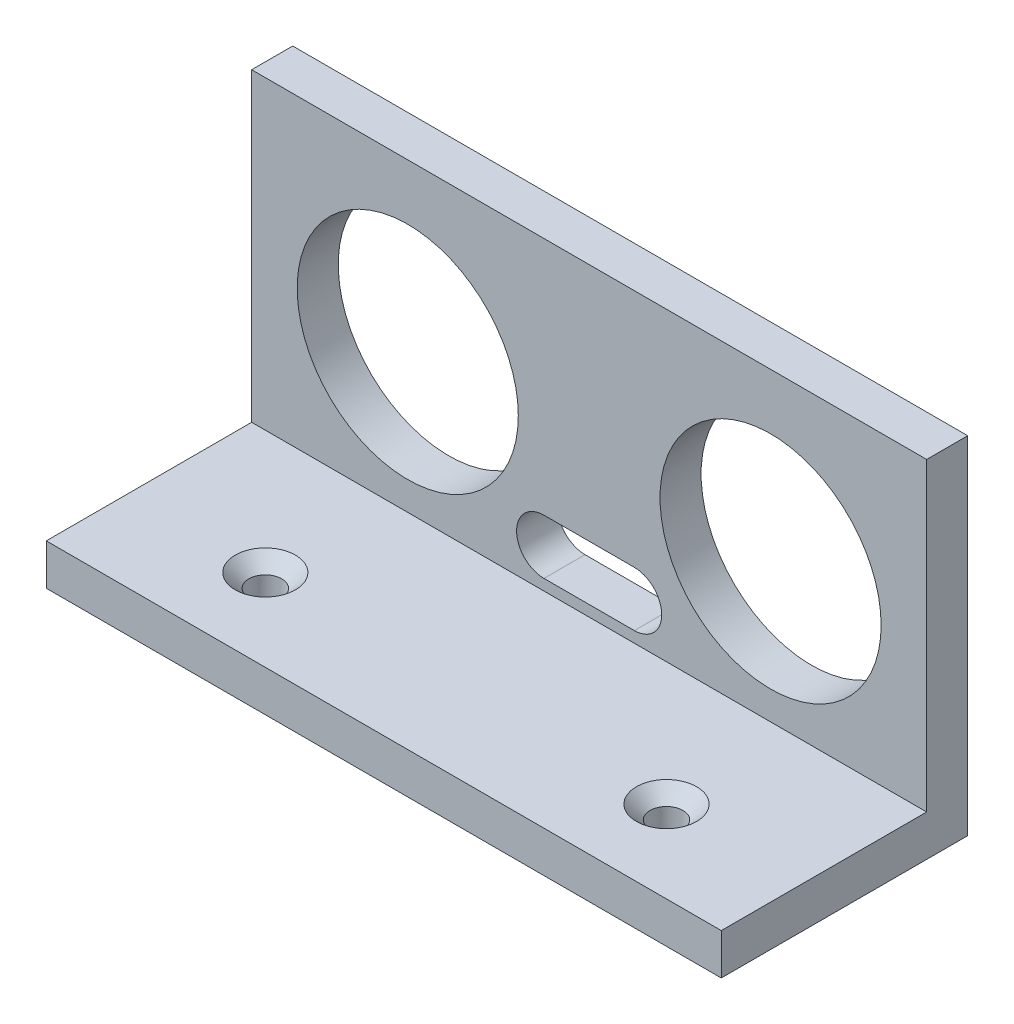
ISO-10303-21;
HEADER;
FILE_DESCRIPTION(('STEP AP214'),'2;1');
FILE_NAME('part.step','',(''),(''),'','','');
FILE_SCHEMA(('AUTOMOTIVE_DESIGN { 1 0 10303 214 1 1 1 1 }'));
ENDSEC;
DATA;
#1=APPLICATION_CONTEXT('core data for automotive mechanical design processes');
#2=APPLICATION_PROTOCOL_DEFINITION('international standard','automotive_design',2000,#1);
#3=PRODUCT_CONTEXT('',#1,'mechanical');
#4=PRODUCT('Part','Part','',(#3));
#5=PRODUCT_RELATED_PRODUCT_CATEGORY('part','',(#4));
#6=PRODUCT_DEFINITION_FORMATION('','',#4);
#7=PRODUCT_DEFINITION_CONTEXT('part definition',#1,'design');
#8=PRODUCT_DEFINITION('design','',#6,#7);
#9=PRODUCT_DEFINITION_SHAPE('','',#8);
#10=(LENGTH_UNIT() NAMED_UNIT(*) SI_UNIT(.MILLI.,.METRE.));
#11=(NAMED_UNIT(*) PLANE_ANGLE_UNIT() SI_UNIT($,.RADIAN.));
#12=(NAMED_UNIT(*) SI_UNIT($,.STERADIAN.) SOLID_ANGLE_UNIT());
#13=UNCERTAINTY_MEASURE_WITH_UNIT(LENGTH_MEASURE(1.E-05),#10,'distance_accuracy_value','');
#14=(GEOMETRIC_REPRESENTATION_CONTEXT(3) GLOBAL_UNCERTAINTY_ASSIGNED_CONTEXT((#13)) GLOBAL_UNIT_ASSIGNED_CONTEXT((#10,
#11,#12)) REPRESENTATION_CONTEXT('',''));
#15=CARTESIAN_POINT('',(0.,0.,0.));
#16=DIRECTION('',(0.,0.,1.));
#17=DIRECTION('',(1.,0.,0.));
#18=AXIS2_PLACEMENT_3D('',#15,#16,#17);
#19=CARTESIAN_POINT('',(0.,0.,1.5));
#20=DIRECTION('',(0.,0.,-1.));
#21=DIRECTION('',(-1.,0.,0.));
#22=AXIS2_PLACEMENT_3D('',#19,#20,#21);
#23=PLANE('',#22);
#24=CARTESIAN_POINT('',(13.25,0.500000000000002,1.5));
#25=DIRECTION('',(0.,0.,1.));
#26=DIRECTION('',(-1.,0.,0.));
#27=AXIS2_PLACEMENT_3D('',#24,#25,#26);
#28=CIRCLE('',#27,8.075);
#29=CARTESIAN_POINT('',(21.325,0.500000000000002,1.5));
#30=VERTEX_POINT('',#29);
#31=EDGE_CURVE('E169',#30,#30,#28,.T.);
#32=ORIENTED_EDGE('',*,*,#31,.F.);
#33=EDGE_LOOP('',(#32));
#34=FACE_BOUND('',#33,.T.);
#35=DIRECTION('',(-1.,0.,0.));
#36=VECTOR('',#35,1.);
#37=CARTESIAN_POINT('',(-3.3,-4.85,1.5));
#38=LINE('',#37,#36);
#39=CARTESIAN_POINT('',(3.3,-4.85,1.5));
#40=VERTEX_POINT('',#39);
#41=CARTESIAN_POINT('',(-3.3,-4.85,1.5));
#42=VERTEX_POINT('',#41);
#43=EDGE_CURVE('E150',#40,#42,#38,.T.);
#44=ORIENTED_EDGE('',*,*,#43,.F.);
#45=CARTESIAN_POINT('',(3.3,-6.85,1.5));
#46=DIRECTION('',(0.,0.,1.));
#47=DIRECTION('',(-1.,0.,0.));
#48=AXIS2_PLACEMENT_3D('',#45,#46,#47);
#49=CIRCLE('',#48,2.);
#50=CARTESIAN_POINT('',(3.3,-8.85,1.5));
#51=VERTEX_POINT('',#50);
#52=EDGE_CURVE('E65',#51,#40,#49,.T.);
#53=ORIENTED_EDGE('',*,*,#52,.F.);
#54=DIRECTION('',(1.,0.,0.));
#55=VECTOR('',#54,1.);
#56=CARTESIAN_POINT('',(3.3,-8.85,1.5));
#57=LINE('',#56,#55);
#58=CARTESIAN_POINT('',(-3.3,-8.85,1.5));
#59=VERTEX_POINT('',#58);
#60=EDGE_CURVE('E138',#59,#51,#57,.T.);
#61=ORIENTED_EDGE('',*,*,#60,.F.);
#62=CARTESIAN_POINT('',(-3.3,-6.85,1.5));
#63=DIRECTION('',(0.,0.,1.));
#64=DIRECTION('',(1.,0.,0.));
#65=AXIS2_PLACEMENT_3D('',#62,#63,#64);
#66=CIRCLE('',#65,2.);
#67=EDGE_CURVE('E145',#42,#59,#66,.T.);
#68=ORIENTED_EDGE('',*,*,#67,.F.);
#69=EDGE_LOOP('',(#44,#53,#61,#68));
#70=FACE_BOUND('',#69,.T.);
#71=CARTESIAN_POINT('',(-13.25,0.500000000000002,1.5));
#72=DIRECTION('',(0.,0.,1.));
#73=DIRECTION('',(1.,0.,0.));
#74=AXIS2_PLACEMENT_3D('',#71,#72,#73);
#75=CIRCLE('',#74,8.075);
#76=CARTESIAN_POINT('',(-5.175,0.500000000000002,1.5));
#77=VERTEX_POINT('',#76);
#78=EDGE_CURVE('E178',#77,#77,#75,.T.);
#79=ORIENTED_EDGE('',*,*,#78,.F.);
#80=EDGE_LOOP('',(#79));
#81=FACE_BOUND('',#80,.T.);
#82=DIRECTION('',(-1.,0.,0.));
#83=VECTOR('',#82,1.);
#84=CARTESIAN_POINT('',(-24.65,-9.65,1.5));
#85=LINE('',#84,#83);
#86=CARTESIAN_POINT('',(24.65,-9.65,1.5));
#87=VERTEX_POINT('',#86);
#88=CARTESIAN_POINT('',(-24.65,-9.65,1.5));
#89=VERTEX_POINT('',#88);
#90=EDGE_CURVE('E208',#87,#89,#85,.T.);
#91=ORIENTED_EDGE('',*,*,#90,.F.);
#92=DIRECTION('',(0.,1.,0.));
#93=VECTOR('',#92,1.);
#94=CARTESIAN_POINT('',(24.65,-12.65,1.5));
#95=LINE('',#94,#93);
#96=CARTESIAN_POINT('',(24.65,12.65,1.5));
#97=VERTEX_POINT('',#96);
#98=EDGE_CURVE('E236',#87,#97,#95,.T.);
#99=ORIENTED_EDGE('',*,*,#98,.T.);
#100=DIRECTION('',(-1.,0.,0.));
#101=VECTOR('',#100,1.);
#102=CARTESIAN_POINT('',(-24.65,12.65,1.5));
#103=LINE('',#102,#101);
#104=CARTESIAN_POINT('',(-24.65,12.65,1.5));
#105=VERTEX_POINT('',#104);
#106=EDGE_CURVE('E239',#97,#105,#103,.T.);
#107=ORIENTED_EDGE('',*,*,#106,.T.);
#108=DIRECTION('',(0.,-1.,0.));
#109=VECTOR('',#108,1.);
#110=CARTESIAN_POINT('',(-24.65,-12.65,1.5));
#111=LINE('',#110,#109);
#112=EDGE_CURVE('E242',#105,#89,#111,.T.);
#113=ORIENTED_EDGE('',*,*,#112,.T.);
#114=EDGE_LOOP('',(#91,#99,#107,#113));
#115=FACE_BOUND('',#114,.T.);
#116=ADVANCED_FACE('F49',(#34,#70,#81,#115),#23,.F.);
#117=CARTESIAN_POINT('',(24.65,-12.65,1.5));
#118=DIRECTION('',(-1.,0.,0.));
#119=DIRECTION('',(0.,0.,1.));
#120=AXIS2_PLACEMENT_3D('',#117,#118,#119);
#121=PLANE('',#120);
#122=DIRECTION('',(0.,1.,0.));
#123=VECTOR('',#122,1.);
#124=CARTESIAN_POINT('',(24.65,-12.65,-1.5));
#125=LINE('',#124,#123);
#126=CARTESIAN_POINT('',(24.65,-12.65,-1.5));
#127=VERTEX_POINT('',#126);
#128=CARTESIAN_POINT('',(24.65,12.65,-1.5));
#129=VERTEX_POINT('',#128);
#130=EDGE_CURVE('E235',#127,#129,#125,.T.);
#131=ORIENTED_EDGE('',*,*,#130,.T.);
#132=DIRECTION('',(0.,0.,-1.));
#133=VECTOR('',#132,1.);
#134=CARTESIAN_POINT('',(24.65,12.65,1.5));
#135=LINE('',#134,#133);
#136=EDGE_CURVE('E11',#97,#129,#135,.T.);
#137=ORIENTED_EDGE('',*,*,#136,.F.);
#138=ORIENTED_EDGE('',*,*,#98,.F.);
#139=DIRECTION('',(0.,0.,-1.));
#140=VECTOR('',#139,1.);
#141=CARTESIAN_POINT('',(24.65,-9.65,16.5));
#142=LINE('',#141,#140);
#143=CARTESIAN_POINT('',(24.65,-9.65,16.5));
#144=VERTEX_POINT('',#143);
#145=EDGE_CURVE('E231',#144,#87,#142,.T.);
#146=ORIENTED_EDGE('',*,*,#145,.F.);
#147=DIRECTION('',(0.,1.,0.));
#148=VECTOR('',#147,1.);
#149=CARTESIAN_POINT('',(24.65,-12.65,16.5));
#150=LINE('',#149,#148);
#151=CARTESIAN_POINT('',(24.65,-12.65,16.5));
#152=VERTEX_POINT('',#151);
#153=EDGE_CURVE('E209',#152,#144,#150,.T.);
#154=ORIENTED_EDGE('',*,*,#153,.F.);
#155=DIRECTION('',(0.,0.,-1.));
#156=VECTOR('',#155,1.);
#157=CARTESIAN_POINT('',(24.65,-12.65,1.5));
#158=LINE('',#157,#156);
#159=EDGE_CURVE('E245',#152,#127,#158,.T.);
#160=ORIENTED_EDGE('',*,*,#159,.T.);
#161=EDGE_LOOP('',(#131,#137,#138,#146,#154,#160));
#162=FACE_BOUND('',#161,.T.);
#163=ADVANCED_FACE('F51',(#162),#121,.F.);
#164=CARTESIAN_POINT('',(-24.65,12.65,1.5));
#165=DIRECTION('',(0.,-1.,0.));
#166=DIRECTION('',(0.,0.,-1.));
#167=AXIS2_PLACEMENT_3D('',#164,#165,#166);
#168=PLANE('',#167);
#169=DIRECTION('',(-1.,0.,0.));
#170=VECTOR('',#169,1.);
#171=CARTESIAN_POINT('',(-24.65,12.65,-1.5));
#172=LINE('',#171,#170);
#173=CARTESIAN_POINT('',(-24.65,12.65,-1.5));
#174=VERTEX_POINT('',#173);
#175=EDGE_CURVE('E249',#129,#174,#172,.T.);
#176=ORIENTED_EDGE('',*,*,#175,.T.);
#177=DIRECTION('',(0.,0.,-1.));
#178=VECTOR('',#177,1.);
#179=CARTESIAN_POINT('',(-24.65,12.65,1.5));
#180=LINE('',#179,#178);
#181=EDGE_CURVE('E58',#105,#174,#180,.T.);
#182=ORIENTED_EDGE('',*,*,#181,.F.);
#183=ORIENTED_EDGE('',*,*,#106,.F.);
#184=ORIENTED_EDGE('',*,*,#136,.T.);
#185=EDGE_LOOP('',(#176,#182,#183,#184));
#186=FACE_BOUND('',#185,.T.);
#187=ADVANCED_FACE('F292',(#186),#168,.F.);
#188=CARTESIAN_POINT('',(-24.65,-12.65,1.5));
#189=DIRECTION('',(1.,0.,0.));
#190=DIRECTION('',(0.,0.,-1.));
#191=AXIS2_PLACEMENT_3D('',#188,#189,#190);
#192=PLANE('',#191);
#193=DIRECTION('',(0.,-1.,0.));
#194=VECTOR('',#193,1.);
#195=CARTESIAN_POINT('',(-24.65,-12.65,-1.5));
#196=LINE('',#195,#194);
#197=CARTESIAN_POINT('',(-24.65,-12.65,-1.5));
#198=VERTEX_POINT('',#197);
#199=EDGE_CURVE('E252',#174,#198,#196,.T.);
#200=ORIENTED_EDGE('',*,*,#199,.T.);
#201=DIRECTION('',(0.,0.,-1.));
#202=VECTOR('',#201,1.);
#203=CARTESIAN_POINT('',(-24.65,-12.65,1.5));
#204=LINE('',#203,#202);
#205=CARTESIAN_POINT('',(-24.65,-12.65,16.5));
#206=VERTEX_POINT('',#205);
#207=EDGE_CURVE('E260',#206,#198,#204,.T.);
#208=ORIENTED_EDGE('',*,*,#207,.F.);
#209=DIRECTION('',(0.,-1.,0.));
#210=VECTOR('',#209,1.);
#211=CARTESIAN_POINT('',(-24.65,-12.65,16.5));
#212=LINE('',#211,#210);
#213=CARTESIAN_POINT('',(-24.65,-9.65,16.5));
#214=VERTEX_POINT('',#213);
#215=EDGE_CURVE('E216',#214,#206,#212,.T.);
#216=ORIENTED_EDGE('',*,*,#215,.F.);
#217=DIRECTION('',(0.,0.,-1.));
#218=VECTOR('',#217,1.);
#219=CARTESIAN_POINT('',(-24.65,-9.65,16.5));
#220=LINE('',#219,#218);
#221=EDGE_CURVE('E224',#214,#89,#220,.T.);
#222=ORIENTED_EDGE('',*,*,#221,.T.);
#223=ORIENTED_EDGE('',*,*,#112,.F.);
#224=ORIENTED_EDGE('',*,*,#181,.T.);
#225=EDGE_LOOP('',(#200,#208,#216,#222,#223,#224));
#226=FACE_BOUND('',#225,.T.);
#227=ADVANCED_FACE('F270',(#226),#192,.F.);
#228=CARTESIAN_POINT('',(-24.65,-12.65,1.5));
#229=DIRECTION('',(0.,1.,0.));
#230=DIRECTION('',(0.,0.,1.));
#231=AXIS2_PLACEMENT_3D('',#228,#229,#230);
#232=PLANE('',#231);
#233=CARTESIAN_POINT('',(-14.65,-12.65,10.5));
#234=DIRECTION('',(0.,1.,0.));
#235=DIRECTION('',(0.,0.,1.));
#236=AXIS2_PLACEMENT_3D('',#233,#234,#235);
#237=CIRCLE('',#236,1.2);
#238=CARTESIAN_POINT('',(-14.65,-12.65,11.7));
#239=VERTEX_POINT('',#238);
#240=EDGE_CURVE('E193',#239,#239,#237,.T.);
#241=ORIENTED_EDGE('',*,*,#240,.T.);
#242=EDGE_LOOP('',(#241));
#243=FACE_BOUND('',#242,.T.);
#244=CARTESIAN_POINT('',(14.65,-12.65,10.5));
#245=DIRECTION('',(0.,1.,0.));
#246=DIRECTION('',(0.,0.,1.));
#247=AXIS2_PLACEMENT_3D('',#244,#245,#246);
#248=CIRCLE('',#247,1.2);
#249=CARTESIAN_POINT('',(14.65,-12.65,11.7));
#250=VERTEX_POINT('',#249);
#251=EDGE_CURVE('E204',#250,#250,#248,.T.);
#252=ORIENTED_EDGE('',*,*,#251,.T.);
#253=EDGE_LOOP('',(#252));
#254=FACE_BOUND('',#253,.T.);
#255=DIRECTION('',(1.,0.,0.));
#256=VECTOR('',#255,1.);
#257=CARTESIAN_POINT('',(-24.65,-12.65,-1.5));
#258=LINE('',#257,#256);
#259=EDGE_CURVE('E240',#198,#127,#258,.T.);
#260=ORIENTED_EDGE('',*,*,#259,.T.);
#261=ORIENTED_EDGE('',*,*,#159,.F.);
#262=DIRECTION('',(1.,0.,0.));
#263=VECTOR('',#262,1.);
#264=CARTESIAN_POINT('',(-24.65,-12.65,16.5));
#265=LINE('',#264,#263);
#266=EDGE_CURVE('E220',#206,#152,#265,.T.);
#267=ORIENTED_EDGE('',*,*,#266,.F.);
#268=ORIENTED_EDGE('',*,*,#207,.T.);
#269=EDGE_LOOP('',(#260,#261,#267,#268));
#270=FACE_BOUND('',#269,.T.);
#271=ADVANCED_FACE('F278',(#243,#254,#270),#232,.F.);
#272=CARTESIAN_POINT('',(0.,0.,-1.5));
#273=DIRECTION('',(0.,0.,-1.));
#274=DIRECTION('',(-1.,0.,0.));
#275=AXIS2_PLACEMENT_3D('',#272,#273,#274);
#276=PLANE('',#275);
#277=CARTESIAN_POINT('',(13.25,0.500000000000002,-1.5));
#278=DIRECTION('',(0.,0.,-1.));
#279=DIRECTION('',(-1.,0.,0.));
#280=AXIS2_PLACEMENT_3D('',#277,#278,#279);
#281=CIRCLE('',#280,8.075);
#282=CARTESIAN_POINT('',(21.325,0.500000000000002,-1.5));
#283=VERTEX_POINT('',#282);
#284=EDGE_CURVE('E170',#283,#283,#281,.F.);
#285=ORIENTED_EDGE('',*,*,#284,.T.);
#286=EDGE_LOOP('',(#285));
#287=FACE_BOUND('',#286,.T.);
#288=CARTESIAN_POINT('',(3.3,-6.85,-1.5));
#289=DIRECTION('',(0.,0.,-1.));
#290=DIRECTION('',(-1.,0.,0.));
#291=AXIS2_PLACEMENT_3D('',#288,#289,#290);
#292=CIRCLE('',#291,2.);
#293=CARTESIAN_POINT('',(3.3,-8.85,-1.5));
#294=VERTEX_POINT('',#293);
#295=CARTESIAN_POINT('',(3.3,-4.85,-1.5));
#296=VERTEX_POINT('',#295);
#297=EDGE_CURVE('E130',#294,#296,#292,.F.);
#298=ORIENTED_EDGE('',*,*,#297,.T.);
#299=DIRECTION('',(-1.,0.,0.));
#300=VECTOR('',#299,1.);
#301=CARTESIAN_POINT('',(-3.3,-4.85,-1.5));
#302=LINE('',#301,#300);
#303=CARTESIAN_POINT('',(-3.3,-4.85,-1.5));
#304=VERTEX_POINT('',#303);
#305=EDGE_CURVE('E135',#296,#304,#302,.T.);
#306=ORIENTED_EDGE('',*,*,#305,.T.);
#307=CARTESIAN_POINT('',(-3.3,-6.85,-1.5));
#308=DIRECTION('',(0.,0.,-1.));
#309=DIRECTION('',(-1.,0.,0.));
#310=AXIS2_PLACEMENT_3D('',#307,#308,#309);
#311=CIRCLE('',#310,2.);
#312=CARTESIAN_POINT('',(-3.3,-8.85,-1.5));
#313=VERTEX_POINT('',#312);
#314=EDGE_CURVE('E165',#304,#313,#311,.F.);
#315=ORIENTED_EDGE('',*,*,#314,.T.);
#316=DIRECTION('',(1.,0.,0.));
#317=VECTOR('',#316,1.);
#318=CARTESIAN_POINT('',(3.3,-8.85,-1.5));
#319=LINE('',#318,#317);
#320=EDGE_CURVE('E157',#313,#294,#319,.T.);
#321=ORIENTED_EDGE('',*,*,#320,.T.);
#322=EDGE_LOOP('',(#298,#306,#315,#321));
#323=FACE_BOUND('',#322,.T.);
#324=CARTESIAN_POINT('',(-13.25,0.500000000000002,-1.5));
#325=DIRECTION('',(0.,0.,-1.));
#326=DIRECTION('',(-1.,0.,0.));
#327=AXIS2_PLACEMENT_3D('',#324,#325,#326);
#328=CIRCLE('',#327,8.075);
#329=CARTESIAN_POINT('',(-5.175,0.500000000000002,-1.5));
#330=VERTEX_POINT('',#329);
#331=EDGE_CURVE('E174',#330,#330,#328,.F.);
#332=ORIENTED_EDGE('',*,*,#331,.T.);
#333=EDGE_LOOP('',(#332));
#334=FACE_BOUND('',#333,.T.);
#335=ORIENTED_EDGE('',*,*,#130,.F.);
#336=ORIENTED_EDGE('',*,*,#259,.F.);
#337=ORIENTED_EDGE('',*,*,#199,.F.);
#338=ORIENTED_EDGE('',*,*,#175,.F.);
#339=EDGE_LOOP('',(#335,#336,#337,#338));
#340=FACE_BOUND('',#339,.T.);
#341=ADVANCED_FACE('F276',(#287,#323,#334,#340),#276,.T.);
#342=CARTESIAN_POINT('',(-24.65,-9.65,16.5));
#343=DIRECTION('',(0.,-1.,0.));
#344=DIRECTION('',(0.,0.,-1.));
#345=AXIS2_PLACEMENT_3D('',#342,#343,#344);
#346=PLANE('',#345);
#347=CARTESIAN_POINT('',(-14.65,-9.65,10.5));
#348=DIRECTION('',(0.,1.,0.));
#349=DIRECTION('',(0.,0.,1.));
#350=AXIS2_PLACEMENT_3D('',#347,#348,#349);
#351=CIRCLE('',#350,2.2);
#352=CARTESIAN_POINT('',(-14.65,-9.65,12.7));
#353=VERTEX_POINT('',#352);
#354=EDGE_CURVE('E182',#353,#353,#351,.T.);
#355=ORIENTED_EDGE('',*,*,#354,.F.);
#356=EDGE_LOOP('',(#355));
#357=FACE_BOUND('',#356,.T.);
#358=CARTESIAN_POINT('',(14.65,-9.65,10.5));
#359=DIRECTION('',(0.,1.,0.));
#360=DIRECTION('',(0.,0.,1.));
#361=AXIS2_PLACEMENT_3D('',#358,#359,#360);
#362=CIRCLE('',#361,2.2);
#363=CARTESIAN_POINT('',(14.65,-9.65,12.7));
#364=VERTEX_POINT('',#363);
#365=EDGE_CURVE('E197',#364,#364,#362,.T.);
#366=ORIENTED_EDGE('',*,*,#365,.F.);
#367=EDGE_LOOP('',(#366));
#368=FACE_BOUND('',#367,.T.);
#369=ORIENTED_EDGE('',*,*,#90,.T.);
#370=ORIENTED_EDGE('',*,*,#221,.F.);
#371=DIRECTION('',(-1.,0.,0.));
#372=VECTOR('',#371,1.);
#373=CARTESIAN_POINT('',(-24.65,-9.65,16.5));
#374=LINE('',#373,#372);
#375=EDGE_CURVE('E213',#144,#214,#374,.T.);
#376=ORIENTED_EDGE('',*,*,#375,.F.);
#377=ORIENTED_EDGE('',*,*,#145,.T.);
#378=EDGE_LOOP('',(#369,#370,#376,#377));
#379=FACE_BOUND('',#378,.T.);
#380=ADVANCED_FACE('F290',(#357,#368,#379),#346,.F.);
#381=CARTESIAN_POINT('',(0.,0.,16.5));
#382=DIRECTION('',(0.,0.,-1.));
#383=DIRECTION('',(-1.,0.,0.));
#384=AXIS2_PLACEMENT_3D('',#381,#382,#383);
#385=PLANE('',#384);
#386=ORIENTED_EDGE('',*,*,#153,.T.);
#387=ORIENTED_EDGE('',*,*,#375,.T.);
#388=ORIENTED_EDGE('',*,*,#215,.T.);
#389=ORIENTED_EDGE('',*,*,#266,.T.);
#390=EDGE_LOOP('',(#386,#387,#388,#389));
#391=FACE_BOUND('',#390,.T.);
#392=ADVANCED_FACE('F286',(#391),#385,.F.);
#393=CARTESIAN_POINT('',(14.65,-9.65,10.5));
#394=DIRECTION('',(0.,1.,0.));
#395=DIRECTION('',(0.,0.,1.));
#396=AXIS2_PLACEMENT_3D('',#393,#394,#395);
#397=CYLINDRICAL_SURFACE('',#396,1.2);
#398=ORIENTED_EDGE('',*,*,#251,.F.);
#399=EDGE_LOOP('',(#398));
#400=FACE_BOUND('',#399,.T.);
#401=CARTESIAN_POINT('',(14.65,-10.65,10.5));
#402=DIRECTION('',(0.,1.,0.));
#403=DIRECTION('',(0.,0.,1.));
#404=AXIS2_PLACEMENT_3D('',#401,#402,#403);
#405=CIRCLE('',#404,1.2);
#406=CARTESIAN_POINT('',(14.65,-10.65,11.7));
#407=VERTEX_POINT('',#406);
#408=EDGE_CURVE('E200',#407,#407,#405,.T.);
#409=ORIENTED_EDGE('',*,*,#408,.T.);
#410=EDGE_LOOP('',(#409));
#411=FACE_BOUND('',#410,.T.);
#412=ADVANCED_FACE('F316',(#400,#411),#397,.F.);
#413=CARTESIAN_POINT('',(14.65,-9.65,10.5));
#414=DIRECTION('',(0.,1.,0.));
#415=DIRECTION('',(0.,0.,1.));
#416=AXIS2_PLACEMENT_3D('',#413,#414,#415);
#417=CONICAL_SURFACE('',#416,2.2,0.785398163397448);
#418=ORIENTED_EDGE('',*,*,#408,.F.);
#419=EDGE_LOOP('',(#418));
#420=FACE_BOUND('',#419,.T.);
#421=ORIENTED_EDGE('',*,*,#365,.T.);
#422=EDGE_LOOP('',(#421));
#423=FACE_BOUND('',#422,.T.);
#424=ADVANCED_FACE('F319',(#420,#423),#417,.F.);
#425=CARTESIAN_POINT('',(-14.65,-9.65,10.5));
#426=DIRECTION('',(0.,1.,0.));
#427=DIRECTION('',(0.,0.,1.));
#428=AXIS2_PLACEMENT_3D('',#425,#426,#427);
#429=CYLINDRICAL_SURFACE('',#428,1.2);
#430=ORIENTED_EDGE('',*,*,#240,.F.);
#431=EDGE_LOOP('',(#430));
#432=FACE_BOUND('',#431,.T.);
#433=CARTESIAN_POINT('',(-14.65,-10.65,10.5));
#434=DIRECTION('',(0.,1.,0.));
#435=DIRECTION('',(0.,0.,1.));
#436=AXIS2_PLACEMENT_3D('',#433,#434,#435);
#437=CIRCLE('',#436,1.2);
#438=CARTESIAN_POINT('',(-14.65,-10.65,11.7));
#439=VERTEX_POINT('',#438);
#440=EDGE_CURVE('E189',#439,#439,#437,.T.);
#441=ORIENTED_EDGE('',*,*,#440,.T.);
#442=EDGE_LOOP('',(#441));
#443=FACE_BOUND('',#442,.T.);
#444=ADVANCED_FACE('F325',(#432,#443),#429,.F.);
#445=CARTESIAN_POINT('',(-14.65,-9.65,10.5));
#446=DIRECTION('',(0.,1.,0.));
#447=DIRECTION('',(0.,0.,1.));
#448=AXIS2_PLACEMENT_3D('',#445,#446,#447);
#449=CONICAL_SURFACE('',#448,2.2,0.785398163397449);
#450=ORIENTED_EDGE('',*,*,#440,.F.);
#451=EDGE_LOOP('',(#450));
#452=FACE_BOUND('',#451,.T.);
#453=ORIENTED_EDGE('',*,*,#354,.T.);
#454=EDGE_LOOP('',(#453));
#455=FACE_BOUND('',#454,.T.);
#456=ADVANCED_FACE('F335',(#452,#455),#449,.F.);
#457=CARTESIAN_POINT('',(-13.25,0.500000000000002,-1.501));
#458=DIRECTION('',(0.,0.,1.));
#459=DIRECTION('',(1.,0.,0.));
#460=AXIS2_PLACEMENT_3D('',#457,#458,#459);
#461=CYLINDRICAL_SURFACE('',#460,8.075);
#462=CARTESIAN_POINT('',(-5.175,0.500000000000002,-1.5));
#463=CARTESIAN_POINT('',(-5.175,0.500000000000002,-1.46875));
#464=CARTESIAN_POINT('',(-5.175,0.500000000000002,-1.4375));
#465=CARTESIAN_POINT('',(-5.175,0.500000000000002,-1.375));
#466=CARTESIAN_POINT('',(-5.175,0.500000000000002,-1.34375));
#467=CARTESIAN_POINT('',(-5.175,0.500000000000002,-1.28125));
#468=CARTESIAN_POINT('',(-5.175,0.500000000000002,-1.25));
#469=CARTESIAN_POINT('',(-5.175,0.500000000000002,-1.1875));
#470=CARTESIAN_POINT('',(-5.175,0.500000000000002,-1.15625));
#471=CARTESIAN_POINT('',(-5.175,0.500000000000002,-1.09375));
#472=CARTESIAN_POINT('',(-5.175,0.500000000000002,-1.0625));
#473=CARTESIAN_POINT('',(-5.175,0.500000000000002,-1.));
#474=CARTESIAN_POINT('',(-5.175,0.500000000000002,-0.96875));
#475=CARTESIAN_POINT('',(-5.175,0.500000000000002,-0.90625));
#476=CARTESIAN_POINT('',(-5.175,0.500000000000002,-0.875));
#477=CARTESIAN_POINT('',(-5.175,0.500000000000002,-0.8125));
#478=CARTESIAN_POINT('',(-5.175,0.500000000000002,-0.78125));
#479=CARTESIAN_POINT('',(-5.175,0.500000000000002,-0.71875));
#480=CARTESIAN_POINT('',(-5.175,0.500000000000002,-0.6875));
#481=CARTESIAN_POINT('',(-5.175,0.500000000000002,-0.625));
#482=CARTESIAN_POINT('',(-5.175,0.500000000000002,-0.59375));
#483=CARTESIAN_POINT('',(-5.175,0.500000000000002,-0.53125));
#484=CARTESIAN_POINT('',(-5.175,0.500000000000002,-0.5));
#485=CARTESIAN_POINT('',(-5.175,0.500000000000002,-0.4375));
#486=CARTESIAN_POINT('',(-5.175,0.500000000000002,-0.40625));
#487=CARTESIAN_POINT('',(-5.175,0.500000000000002,-0.34375));
#488=CARTESIAN_POINT('',(-5.175,0.500000000000002,-0.3125));
#489=CARTESIAN_POINT('',(-5.175,0.500000000000002,-0.25));
#490=CARTESIAN_POINT('',(-5.175,0.500000000000002,-0.21875));
#491=CARTESIAN_POINT('',(-5.175,0.500000000000002,-0.15625));
#492=CARTESIAN_POINT('',(-5.175,0.500000000000002,-0.125));
#493=CARTESIAN_POINT('',(-5.175,0.500000000000002,-0.0625000000000001));
#494=CARTESIAN_POINT('',(-5.175,0.500000000000002,-0.03125));
#495=CARTESIAN_POINT('',(-5.175,0.500000000000002,0.03125));
#496=CARTESIAN_POINT('',(-5.175,0.500000000000002,0.0625000000000001));
#497=CARTESIAN_POINT('',(-5.175,0.500000000000002,0.125));
#498=CARTESIAN_POINT('',(-5.175,0.500000000000002,0.15625));
#499=CARTESIAN_POINT('',(-5.175,0.500000000000002,0.21875));
#500=CARTESIAN_POINT('',(-5.175,0.500000000000002,0.25));
#501=CARTESIAN_POINT('',(-5.175,0.500000000000002,0.3125));
#502=CARTESIAN_POINT('',(-5.175,0.500000000000002,0.34375));
#503=CARTESIAN_POINT('',(-5.175,0.500000000000002,0.40625));
#504=CARTESIAN_POINT('',(-5.175,0.500000000000002,0.4375));
#505=CARTESIAN_POINT('',(-5.175,0.500000000000002,0.5));
#506=CARTESIAN_POINT('',(-5.175,0.500000000000002,0.53125));
#507=CARTESIAN_POINT('',(-5.175,0.500000000000002,0.59375));
#508=CARTESIAN_POINT('',(-5.175,0.500000000000002,0.625));
#509=CARTESIAN_POINT('',(-5.175,0.500000000000002,0.6875));
#510=CARTESIAN_POINT('',(-5.175,0.500000000000002,0.71875));
#511=CARTESIAN_POINT('',(-5.175,0.500000000000002,0.78125));
#512=CARTESIAN_POINT('',(-5.175,0.500000000000002,0.8125));
#513=CARTESIAN_POINT('',(-5.175,0.500000000000002,0.874999999999999));
#514=CARTESIAN_POINT('',(-5.175,0.500000000000002,0.90625));
#515=CARTESIAN_POINT('',(-5.175,0.500000000000002,0.96875));
#516=CARTESIAN_POINT('',(-5.175,0.500000000000002,1.));
#517=CARTESIAN_POINT('',(-5.175,0.500000000000002,1.0625));
#518=CARTESIAN_POINT('',(-5.175,0.500000000000002,1.09375));
#519=CARTESIAN_POINT('',(-5.175,0.500000000000002,1.15625));
#520=CARTESIAN_POINT('',(-5.175,0.500000000000002,1.1875));
#521=CARTESIAN_POINT('',(-5.175,0.500000000000002,1.25));
#522=CARTESIAN_POINT('',(-5.175,0.500000000000002,1.28125));
#523=CARTESIAN_POINT('',(-5.175,0.500000000000002,1.34375));
#524=CARTESIAN_POINT('',(-5.175,0.500000000000002,1.375));
#525=CARTESIAN_POINT('',(-5.175,0.500000000000002,1.4375));
#526=CARTESIAN_POINT('',(-5.175,0.500000000000002,1.46875));
#527=CARTESIAN_POINT('',(-5.175,0.500000000000002,1.5));
#528=B_SPLINE_CURVE_WITH_KNOTS('',3,(#462,#463,#464,#465,#466,#467,#468,#469,#470,#471,#472,
#473,#474,#475,#476,#477,#478,#479,#480,#481,#482,#483,#484,#485,#486,#487,#488,#489,#490,#491,
#492,#493,#494,#495,#496,#497,#498,#499,#500,#501,#502,#503,#504,#505,#506,#507,#508,#509,#510,
#511,#512,#513,#514,#515,#516,#517,#518,#519,#520,#521,#522,#523,#524,#525,#526,#527),
.UNSPECIFIED.,.F.,.F.,(4,2,2,2,2,2,2,2,2,2,2,2,2,2,2,2,2,2,2,2,2,2,2,2,2,2,2,2,2,2,2,2,4),(0.,
0.0937499999999999,0.1875,0.28125,0.375,0.46875,0.5625,0.65625,0.75,0.84375,0.9375,1.03125,
1.125,1.21875,1.3125,1.40625,1.5,1.59375,1.6875,1.78125,1.875,1.96875,2.0625,2.15625,2.25,
2.34375,2.4375,2.53125,2.625,2.71875,2.8125,2.90625,3.),.UNSPECIFIED.);
#529=EDGE_CURVE('BSEAM337',#330,#77,#528,.T.);
#530=ORIENTED_EDGE('',*,*,#331,.F.);
#531=ORIENTED_EDGE('',*,*,#78,.T.);
#532=ORIENTED_EDGE('',*,*,#529,.T.);
#533=ORIENTED_EDGE('',*,*,#529,.F.);
#534=EDGE_LOOP('',(#530,#532,#531,#533));
#535=FACE_BOUND('',#534,.T.);
#536=ADVANCED_FACE('F337',(#535),#461,.F.);
#537=CARTESIAN_POINT('',(3.3,-6.85,-1.501));
#538=DIRECTION('',(0.,0.,1.));
#539=DIRECTION('',(1.,0.,0.));
#540=AXIS2_PLACEMENT_3D('',#537,#538,#539);
#541=CYLINDRICAL_SURFACE('',#540,2.);
#542=DIRECTION('',(0.,0.,1.));
#543=VECTOR('',#542,1.);
#544=CARTESIAN_POINT('',(3.3,-8.85,-1.501));
#545=LINE('',#544,#543);
#546=EDGE_CURVE('E126',#294,#51,#545,.T.);
#547=ORIENTED_EDGE('',*,*,#546,.T.);
#548=ORIENTED_EDGE('',*,*,#52,.T.);
#549=DIRECTION('',(0.,0.,1.));
#550=VECTOR('',#549,1.);
#551=CARTESIAN_POINT('',(3.3,-4.85,-1.501));
#552=LINE('',#551,#550);
#553=EDGE_CURVE('E146',#296,#40,#552,.T.);
#554=ORIENTED_EDGE('',*,*,#553,.F.);
#555=ORIENTED_EDGE('',*,*,#297,.F.);
#556=EDGE_LOOP('',(#547,#548,#554,#555));
#557=FACE_BOUND('',#556,.T.);
#558=ADVANCED_FACE('F128',(#557),#541,.F.);
#559=CARTESIAN_POINT('',(3.3,-8.85,-1.501));
#560=DIRECTION('',(0.,-1.,0.));
#561=DIRECTION('',(0.,0.,-1.));
#562=AXIS2_PLACEMENT_3D('',#559,#560,#561);
#563=PLANE('',#562);
#564=DIRECTION('',(0.,0.,1.));
#565=VECTOR('',#564,1.);
#566=CARTESIAN_POINT('',(-3.3,-8.85,-1.501));
#567=LINE('',#566,#565);
#568=EDGE_CURVE('E134',#313,#59,#567,.T.);
#569=ORIENTED_EDGE('',*,*,#568,.T.);
#570=ORIENTED_EDGE('',*,*,#60,.T.);
#571=ORIENTED_EDGE('',*,*,#546,.F.);
#572=ORIENTED_EDGE('',*,*,#320,.F.);
#573=EDGE_LOOP('',(#569,#570,#571,#572));
#574=FACE_BOUND('',#573,.T.);
#575=ADVANCED_FACE('F139',(#574),#563,.F.);
#576=CARTESIAN_POINT('',(-3.3,-6.85,-1.501));
#577=DIRECTION('',(0.,0.,1.));
#578=DIRECTION('',(1.,0.,0.));
#579=AXIS2_PLACEMENT_3D('',#576,#577,#578);
#580=CYLINDRICAL_SURFACE('',#579,2.);
#581=DIRECTION('',(0.,0.,1.));
#582=VECTOR('',#581,1.);
#583=CARTESIAN_POINT('',(-3.3,-4.85,-1.501));
#584=LINE('',#583,#582);
#585=EDGE_CURVE('E73',#304,#42,#584,.T.);
#586=ORIENTED_EDGE('',*,*,#585,.T.);
#587=ORIENTED_EDGE('',*,*,#67,.T.);
#588=ORIENTED_EDGE('',*,*,#568,.F.);
#589=ORIENTED_EDGE('',*,*,#314,.F.);
#590=EDGE_LOOP('',(#586,#587,#588,#589));
#591=FACE_BOUND('',#590,.T.);
#592=ADVANCED_FACE('F356',(#591),#580,.F.);
#593=CARTESIAN_POINT('',(-3.3,-4.85,-1.501));
#594=DIRECTION('',(0.,1.,0.));
#595=DIRECTION('',(-1.,0.,0.));
#596=AXIS2_PLACEMENT_3D('',#593,#594,#595);
#597=PLANE('',#596);
#598=ORIENTED_EDGE('',*,*,#553,.T.);
#599=ORIENTED_EDGE('',*,*,#43,.T.);
#600=ORIENTED_EDGE('',*,*,#585,.F.);
#601=ORIENTED_EDGE('',*,*,#305,.F.);
#602=EDGE_LOOP('',(#598,#599,#600,#601));
#603=FACE_BOUND('',#602,.T.);
#604=ADVANCED_FACE('F352',(#603),#597,.F.);
#605=CARTESIAN_POINT('',(13.25,0.500000000000002,-1.501));
#606=DIRECTION('',(0.,0.,1.));
#607=DIRECTION('',(1.,0.,0.));
#608=AXIS2_PLACEMENT_3D('',#605,#606,#607);
#609=CYLINDRICAL_SURFACE('',#608,8.075);
#610=CARTESIAN_POINT('',(21.325,0.500000000000002,-1.5));
#611=CARTESIAN_POINT('',(21.325,0.500000000000002,-1.46875));
#612=CARTESIAN_POINT('',(21.325,0.500000000000002,-1.4375));
#613=CARTESIAN_POINT('',(21.325,0.500000000000002,-1.375));
#614=CARTESIAN_POINT('',(21.325,0.500000000000002,-1.34375));
#615=CARTESIAN_POINT('',(21.325,0.500000000000002,-1.28125));
#616=CARTESIAN_POINT('',(21.325,0.500000000000002,-1.25));
#617=CARTESIAN_POINT('',(21.325,0.500000000000002,-1.1875));
#618=CARTESIAN_POINT('',(21.325,0.500000000000002,-1.15625));
#619=CARTESIAN_POINT('',(21.325,0.500000000000002,-1.09375));
#620=CARTESIAN_POINT('',(21.325,0.500000000000002,-1.0625));
#621=CARTESIAN_POINT('',(21.325,0.500000000000002,-1.));
#622=CARTESIAN_POINT('',(21.325,0.500000000000002,-0.96875));
#623=CARTESIAN_POINT('',(21.325,0.500000000000002,-0.90625));
#624=CARTESIAN_POINT('',(21.325,0.500000000000002,-0.875));
#625=CARTESIAN_POINT('',(21.325,0.500000000000002,-0.8125));
#626=CARTESIAN_POINT('',(21.325,0.500000000000002,-0.78125));
#627=CARTESIAN_POINT('',(21.325,0.500000000000002,-0.71875));
#628=CARTESIAN_POINT('',(21.325,0.500000000000002,-0.6875));
#629=CARTESIAN_POINT('',(21.325,0.500000000000002,-0.625));
#630=CARTESIAN_POINT('',(21.325,0.500000000000002,-0.59375));
#631=CARTESIAN_POINT('',(21.325,0.500000000000002,-0.53125));
#632=CARTESIAN_POINT('',(21.325,0.500000000000002,-0.5));
#633=CARTESIAN_POINT('',(21.325,0.500000000000002,-0.4375));
#634=CARTESIAN_POINT('',(21.325,0.500000000000002,-0.40625));
#635=CARTESIAN_POINT('',(21.325,0.500000000000002,-0.34375));
#636=CARTESIAN_POINT('',(21.325,0.500000000000002,-0.3125));
#637=CARTESIAN_POINT('',(21.325,0.500000000000002,-0.25));
#638=CARTESIAN_POINT('',(21.325,0.500000000000002,-0.21875));
#639=CARTESIAN_POINT('',(21.325,0.500000000000002,-0.15625));
#640=CARTESIAN_POINT('',(21.325,0.500000000000002,-0.125));
#641=CARTESIAN_POINT('',(21.325,0.500000000000002,-0.0625000000000001));
#642=CARTESIAN_POINT('',(21.325,0.500000000000002,-0.03125));
#643=CARTESIAN_POINT('',(21.325,0.500000000000002,0.03125));
#644=CARTESIAN_POINT('',(21.325,0.500000000000002,0.0625000000000001));
#645=CARTESIAN_POINT('',(21.325,0.500000000000002,0.125));
#646=CARTESIAN_POINT('',(21.325,0.500000000000002,0.15625));
#647=CARTESIAN_POINT('',(21.325,0.500000000000002,0.21875));
#648=CARTESIAN_POINT('',(21.325,0.500000000000002,0.25));
#649=CARTESIAN_POINT('',(21.325,0.500000000000002,0.3125));
#650=CARTESIAN_POINT('',(21.325,0.500000000000002,0.34375));
#651=CARTESIAN_POINT('',(21.325,0.500000000000002,0.40625));
#652=CARTESIAN_POINT('',(21.325,0.500000000000002,0.4375));
#653=CARTESIAN_POINT('',(21.325,0.500000000000002,0.5));
#654=CARTESIAN_POINT('',(21.325,0.500000000000002,0.53125));
#655=CARTESIAN_POINT('',(21.325,0.500000000000002,0.59375));
#656=CARTESIAN_POINT('',(21.325,0.500000000000002,0.625));
#657=CARTESIAN_POINT('',(21.325,0.500000000000002,0.6875));
#658=CARTESIAN_POINT('',(21.325,0.500000000000002,0.71875));
#659=CARTESIAN_POINT('',(21.325,0.500000000000002,0.78125));
#660=CARTESIAN_POINT('',(21.325,0.500000000000002,0.8125));
#661=CARTESIAN_POINT('',(21.325,0.500000000000002,0.874999999999999));
#662=CARTESIAN_POINT('',(21.325,0.500000000000002,0.90625));
#663=CARTESIAN_POINT('',(21.325,0.500000000000002,0.96875));
#664=CARTESIAN_POINT('',(21.325,0.500000000000002,1.));
#665=CARTESIAN_POINT('',(21.325,0.500000000000002,1.0625));
#666=CARTESIAN_POINT('',(21.325,0.500000000000002,1.09375));
#667=CARTESIAN_POINT('',(21.325,0.500000000000002,1.15625));
#668=CARTESIAN_POINT('',(21.325,0.500000000000002,1.1875));
#669=CARTESIAN_POINT('',(21.325,0.500000000000002,1.25));
#670=CARTESIAN_POINT('',(21.325,0.500000000000002,1.28125));
#671=CARTESIAN_POINT('',(21.325,0.500000000000002,1.34375));
#672=CARTESIAN_POINT('',(21.325,0.500000000000002,1.375));
#673=CARTESIAN_POINT('',(21.325,0.500000000000002,1.4375));
#674=CARTESIAN_POINT('',(21.325,0.500000000000002,1.46875));
#675=CARTESIAN_POINT('',(21.325,0.500000000000002,1.5));
#676=B_SPLINE_CURVE_WITH_KNOTS('',3,(#610,#611,#612,#613,#614,#615,#616,#617,#618,#619,#620,
#621,#622,#623,#624,#625,#626,#627,#628,#629,#630,#631,#632,#633,#634,#635,#636,#637,#638,#639,
#640,#641,#642,#643,#644,#645,#646,#647,#648,#649,#650,#651,#652,#653,#654,#655,#656,#657,#658,
#659,#660,#661,#662,#663,#664,#665,#666,#667,#668,#669,#670,#671,#672,#673,#674,#675),
.UNSPECIFIED.,.F.,.F.,(4,2,2,2,2,2,2,2,2,2,2,2,2,2,2,2,2,2,2,2,2,2,2,2,2,2,2,2,2,2,2,2,4),(0.,
0.0937499999999999,0.1875,0.28125,0.375,0.46875,0.5625,0.65625,0.75,0.84375,0.9375,1.03125,
1.125,1.21875,1.3125,1.40625,1.5,1.59375,1.6875,1.78125,1.875,1.96875,2.0625,2.15625,2.25,
2.34375,2.4375,2.53125,2.625,2.71875,2.8125,2.90625,3.),.UNSPECIFIED.);
#677=EDGE_CURVE('BSEAM349',#283,#30,#676,.T.);
#678=ORIENTED_EDGE('',*,*,#284,.F.);
#679=ORIENTED_EDGE('',*,*,#31,.T.);
#680=ORIENTED_EDGE('',*,*,#677,.T.);
#681=ORIENTED_EDGE('',*,*,#677,.F.);
#682=EDGE_LOOP('',(#678,#680,#679,#681));
#683=FACE_BOUND('',#682,.T.);
#684=ADVANCED_FACE('F349',(#683),#609,.F.);
#685=CLOSED_SHELL('',(#116,#163,#187,#227,#271,#341,#380,#392,#412,#424,#444,#456,#536,#558,
#575,#592,#604,#684));
#686=MANIFOLD_SOLID_BREP('B2',#685);
#687=ADVANCED_BREP_SHAPE_REPRESENTATION('',(#18,#686),#14);
#688=SHAPE_DEFINITION_REPRESENTATION(#9,#687);
ENDSEC;
END-ISO-10303-21;
